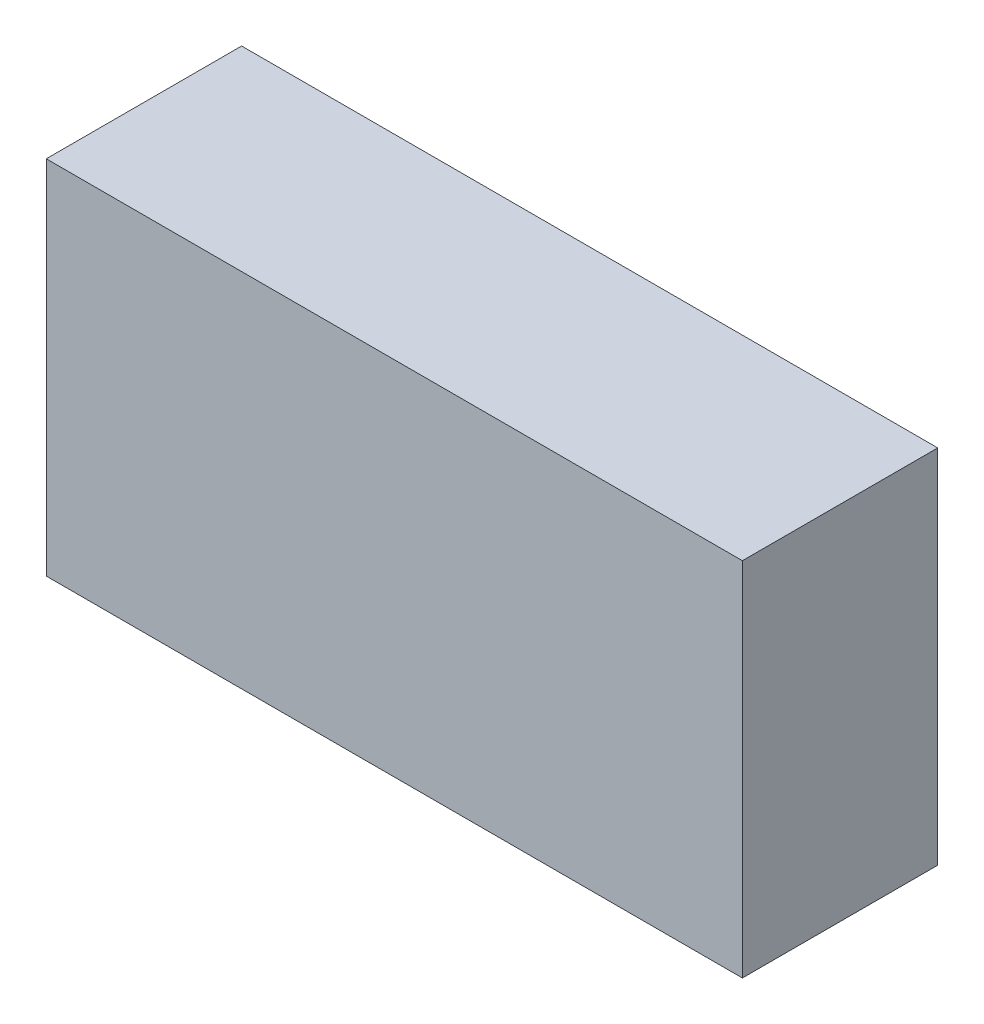
ISO-10303-21;
HEADER;
FILE_DESCRIPTION(('STEP AP214'),'2;1');
FILE_NAME('part.step','',(''),(''),'','','');
FILE_SCHEMA(('AUTOMOTIVE_DESIGN { 1 0 10303 214 1 1 1 1 }'));
ENDSEC;
DATA;
#1=APPLICATION_CONTEXT('core data for automotive mechanical design processes');
#2=APPLICATION_PROTOCOL_DEFINITION('international standard','automotive_design',2000,#1);
#3=PRODUCT_CONTEXT('',#1,'mechanical');
#4=PRODUCT('Part','Part','',(#3));
#5=PRODUCT_RELATED_PRODUCT_CATEGORY('part','',(#4));
#6=PRODUCT_DEFINITION_FORMATION('','',#4);
#7=PRODUCT_DEFINITION_CONTEXT('part definition',#1,'design');
#8=PRODUCT_DEFINITION('design','',#6,#7);
#9=PRODUCT_DEFINITION_SHAPE('','',#8);
#10=(LENGTH_UNIT() NAMED_UNIT(*) SI_UNIT(.MILLI.,.METRE.));
#11=(NAMED_UNIT(*) PLANE_ANGLE_UNIT() SI_UNIT($,.RADIAN.));
#12=(NAMED_UNIT(*) SI_UNIT($,.STERADIAN.) SOLID_ANGLE_UNIT());
#13=UNCERTAINTY_MEASURE_WITH_UNIT(LENGTH_MEASURE(1.E-05),#10,'distance_accuracy_value','');
#14=(GEOMETRIC_REPRESENTATION_CONTEXT(3) GLOBAL_UNCERTAINTY_ASSIGNED_CONTEXT((#13)) GLOBAL_UNIT_ASSIGNED_CONTEXT((#10,
#11,#12)) REPRESENTATION_CONTEXT('',''));
#15=CARTESIAN_POINT('',(0.,0.,0.));
#16=DIRECTION('',(0.,0.,1.));
#17=DIRECTION('',(1.,0.,0.));
#18=AXIS2_PLACEMENT_3D('',#15,#16,#17);
#19=CARTESIAN_POINT('',(-2.0135,0.95,1.));
#20=DIRECTION('',(0.,0.,1.));
#21=DIRECTION('',(1.,0.,0.));
#22=AXIS2_PLACEMENT_3D('',#19,#20,#21);
#23=PLANE('',#22);
#24=DIRECTION('',(0.,1.,0.));
#25=VECTOR('',#24,1.);
#26=CARTESIAN_POINT('',(1.55,0.95,1.));
#27=LINE('',#26,#25);
#28=CARTESIAN_POINT('',(1.55,0.95,1.));
#29=VERTEX_POINT('',#28);
#30=CARTESIAN_POINT('',(1.55,-0.9,1.));
#31=VERTEX_POINT('',#30);
#32=EDGE_CURVE('E53',#29,#31,#27,.F.);
#33=ORIENTED_EDGE('',*,*,#32,.F.);
#34=DIRECTION('',(1.,0.,0.));
#35=VECTOR('',#34,1.);
#36=CARTESIAN_POINT('',(-2.0135,0.95,1.));
#37=LINE('',#36,#35);
#38=CARTESIAN_POINT('',(-2.0135,0.95,1.));
#39=VERTEX_POINT('',#38);
#40=EDGE_CURVE('E68',#39,#29,#37,.T.);
#41=ORIENTED_EDGE('',*,*,#40,.F.);
#42=DIRECTION('',(0.,1.,0.));
#43=VECTOR('',#42,1.);
#44=CARTESIAN_POINT('',(-2.0135,-0.9,1.));
#45=LINE('',#44,#43);
#46=CARTESIAN_POINT('',(-2.0135,-0.9,1.));
#47=VERTEX_POINT('',#46);
#48=EDGE_CURVE('E20',#47,#39,#45,.T.);
#49=ORIENTED_EDGE('',*,*,#48,.F.);
#50=DIRECTION('',(1.,0.,0.));
#51=VECTOR('',#50,1.);
#52=CARTESIAN_POINT('',(1.55,-0.9,1.));
#53=LINE('',#52,#51);
#54=EDGE_CURVE('E58',#31,#47,#53,.F.);
#55=ORIENTED_EDGE('',*,*,#54,.F.);
#56=EDGE_LOOP('',(#33,#41,#49,#55));
#57=FACE_BOUND('',#56,.T.);
#58=ADVANCED_FACE('F17',(#57),#23,.T.);
#59=CARTESIAN_POINT('',(-2.0135,-0.9,0.));
#60=DIRECTION('',(-1.,0.,0.));
#61=DIRECTION('',(0.,0.,1.));
#62=AXIS2_PLACEMENT_3D('',#59,#60,#61);
#63=PLANE('',#62);
#64=DIRECTION('',(0.,0.,1.));
#65=VECTOR('',#64,1.);
#66=CARTESIAN_POINT('',(-2.0135,0.95,0.));
#67=LINE('',#66,#65);
#68=CARTESIAN_POINT('',(-2.0135,0.95,0.));
#69=VERTEX_POINT('',#68);
#70=EDGE_CURVE('E79',#69,#39,#67,.T.);
#71=ORIENTED_EDGE('',*,*,#70,.F.);
#72=DIRECTION('',(0.,1.,0.));
#73=VECTOR('',#72,1.);
#74=CARTESIAN_POINT('',(-2.0135,0.95,0.));
#75=LINE('',#74,#73);
#76=CARTESIAN_POINT('',(-2.0135,-0.9,0.));
#77=VERTEX_POINT('',#76);
#78=EDGE_CURVE('E74',#69,#77,#75,.F.);
#79=ORIENTED_EDGE('',*,*,#78,.T.);
#80=DIRECTION('',(0.,0.,-1.));
#81=VECTOR('',#80,1.);
#82=CARTESIAN_POINT('',(-2.0135,-0.9,0.));
#83=LINE('',#82,#81);
#84=EDGE_CURVE('E63',#47,#77,#83,.T.);
#85=ORIENTED_EDGE('',*,*,#84,.F.);
#86=ORIENTED_EDGE('',*,*,#48,.T.);
#87=EDGE_LOOP('',(#71,#79,#85,#86));
#88=FACE_BOUND('',#87,.T.);
#89=ADVANCED_FACE('F73',(#88),#63,.T.);
#90=CARTESIAN_POINT('',(1.55,-0.9,0.));
#91=DIRECTION('',(0.,-1.,0.));
#92=DIRECTION('',(0.,0.,-1.));
#93=AXIS2_PLACEMENT_3D('',#90,#91,#92);
#94=PLANE('',#93);
#95=ORIENTED_EDGE('',*,*,#84,.T.);
#96=DIRECTION('',(1.,0.,0.));
#97=VECTOR('',#96,1.);
#98=CARTESIAN_POINT('',(-2.0135,-0.9,0.));
#99=LINE('',#98,#97);
#100=CARTESIAN_POINT('',(1.55,-0.9,0.));
#101=VERTEX_POINT('',#100);
#102=EDGE_CURVE('E84',#77,#101,#99,.T.);
#103=ORIENTED_EDGE('',*,*,#102,.T.);
#104=DIRECTION('',(0.,0.,-1.));
#105=VECTOR('',#104,1.);
#106=CARTESIAN_POINT('',(1.55,-0.9,0.));
#107=LINE('',#106,#105);
#108=EDGE_CURVE('E65',#31,#101,#107,.T.);
#109=ORIENTED_EDGE('',*,*,#108,.F.);
#110=ORIENTED_EDGE('',*,*,#54,.T.);
#111=EDGE_LOOP('',(#95,#103,#109,#110));
#112=FACE_BOUND('',#111,.T.);
#113=ADVANCED_FACE('F60',(#112),#94,.T.);
#114=CARTESIAN_POINT('',(1.55,0.95,0.));
#115=DIRECTION('',(1.,0.,0.));
#116=DIRECTION('',(0.,0.,-1.));
#117=AXIS2_PLACEMENT_3D('',#114,#115,#116);
#118=PLANE('',#117);
#119=ORIENTED_EDGE('',*,*,#108,.T.);
#120=DIRECTION('',(0.,1.,0.));
#121=VECTOR('',#120,1.);
#122=CARTESIAN_POINT('',(1.55,0.95,0.));
#123=LINE('',#122,#121);
#124=CARTESIAN_POINT('',(1.55,0.95,0.));
#125=VERTEX_POINT('',#124);
#126=EDGE_CURVE('E26',#101,#125,#123,.T.);
#127=ORIENTED_EDGE('',*,*,#126,.T.);
#128=DIRECTION('',(0.,0.,1.));
#129=VECTOR('',#128,1.);
#130=CARTESIAN_POINT('',(1.55,0.95,0.));
#131=LINE('',#130,#129);
#132=EDGE_CURVE('E34',#29,#125,#131,.F.);
#133=ORIENTED_EDGE('',*,*,#132,.F.);
#134=ORIENTED_EDGE('',*,*,#32,.T.);
#135=EDGE_LOOP('',(#119,#127,#133,#134));
#136=FACE_BOUND('',#135,.T.);
#137=ADVANCED_FACE('F88',(#136),#118,.T.);
#138=CARTESIAN_POINT('',(-2.0135,0.95,0.));
#139=DIRECTION('',(0.,1.,0.));
#140=DIRECTION('',(0.,0.,1.));
#141=AXIS2_PLACEMENT_3D('',#138,#139,#140);
#142=PLANE('',#141);
#143=ORIENTED_EDGE('',*,*,#132,.T.);
#144=DIRECTION('',(1.,0.,0.));
#145=VECTOR('',#144,1.);
#146=CARTESIAN_POINT('',(-2.0135,0.95,0.));
#147=LINE('',#146,#145);
#148=EDGE_CURVE('E11',#125,#69,#147,.F.);
#149=ORIENTED_EDGE('',*,*,#148,.T.);
#150=ORIENTED_EDGE('',*,*,#70,.T.);
#151=ORIENTED_EDGE('',*,*,#40,.T.);
#152=EDGE_LOOP('',(#143,#149,#150,#151));
#153=FACE_BOUND('',#152,.T.);
#154=ADVANCED_FACE('F91',(#153),#142,.T.);
#155=CARTESIAN_POINT('',(-2.0135,0.95,0.));
#156=DIRECTION('',(0.,0.,1.));
#157=DIRECTION('',(1.,0.,0.));
#158=AXIS2_PLACEMENT_3D('',#155,#156,#157);
#159=PLANE('',#158);
#160=ORIENTED_EDGE('',*,*,#126,.F.);
#161=ORIENTED_EDGE('',*,*,#102,.F.);
#162=ORIENTED_EDGE('',*,*,#78,.F.);
#163=ORIENTED_EDGE('',*,*,#148,.F.);
#164=EDGE_LOOP('',(#160,#161,#162,#163));
#165=FACE_BOUND('',#164,.T.);
#166=ADVANCED_FACE('F90',(#165),#159,.F.);
#167=CLOSED_SHELL('',(#58,#89,#113,#137,#154,#166));
#168=MANIFOLD_SOLID_BREP('B1',#167);
#169=ADVANCED_BREP_SHAPE_REPRESENTATION('',(#18,#168),#14);
#170=SHAPE_DEFINITION_REPRESENTATION(#9,#169);
ENDSEC;
END-ISO-10303-21;
